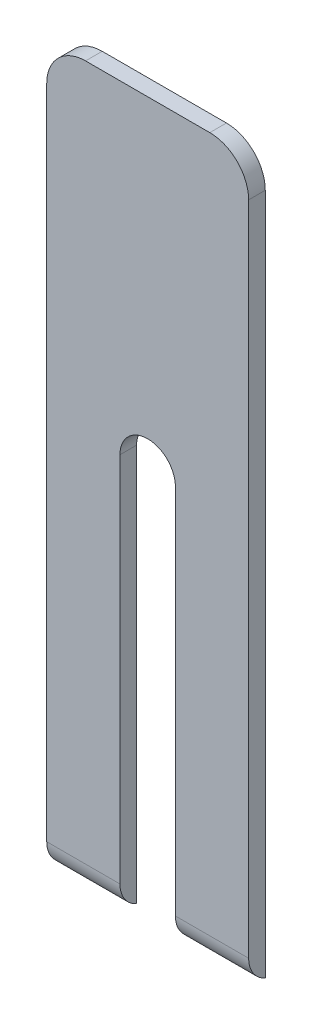
ISO-10303-21;
HEADER;
FILE_DESCRIPTION(('STEP AP214'),'2;1');
FILE_NAME('part.step','',(''),(''),'','','');
FILE_SCHEMA(('AUTOMOTIVE_DESIGN { 1 0 10303 214 1 1 1 1 }'));
ENDSEC;
DATA;
#1=APPLICATION_CONTEXT('core data for automotive mechanical design processes');
#2=APPLICATION_PROTOCOL_DEFINITION('international standard','automotive_design',2000,#1);
#3=PRODUCT_CONTEXT('',#1,'mechanical');
#4=PRODUCT('Part','Part','',(#3));
#5=PRODUCT_RELATED_PRODUCT_CATEGORY('part','',(#4));
#6=PRODUCT_DEFINITION_FORMATION('','',#4);
#7=PRODUCT_DEFINITION_CONTEXT('part definition',#1,'design');
#8=PRODUCT_DEFINITION('design','',#6,#7);
#9=PRODUCT_DEFINITION_SHAPE('','',#8);
#10=(LENGTH_UNIT() NAMED_UNIT(*) SI_UNIT(.MILLI.,.METRE.));
#11=(NAMED_UNIT(*) PLANE_ANGLE_UNIT() SI_UNIT($,.RADIAN.));
#12=(NAMED_UNIT(*) SI_UNIT($,.STERADIAN.) SOLID_ANGLE_UNIT());
#13=UNCERTAINTY_MEASURE_WITH_UNIT(LENGTH_MEASURE(1.E-05),#10,'distance_accuracy_value','');
#14=(GEOMETRIC_REPRESENTATION_CONTEXT(3) GLOBAL_UNCERTAINTY_ASSIGNED_CONTEXT((#13)) GLOBAL_UNIT_ASSIGNED_CONTEXT((#10,
#11,#12)) REPRESENTATION_CONTEXT('',''));
#15=CARTESIAN_POINT('',(0.,0.,0.));
#16=DIRECTION('',(0.,0.,1.));
#17=DIRECTION('',(1.,0.,0.));
#18=AXIS2_PLACEMENT_3D('',#15,#16,#17);
#19=CARTESIAN_POINT('',(1.32,0.,0.3));
#20=DIRECTION('',(-1.,0.,0.));
#21=DIRECTION('',(0.,-1.,0.));
#22=AXIS2_PLACEMENT_3D('',#19,#20,#21);
#23=PLANE('',#22);
#24=DIRECTION('',(0.,1.,0.));
#25=VECTOR('',#24,1.);
#26=CARTESIAN_POINT('',(1.32,0.,0.3));
#27=LINE('',#26,#25);
#28=CARTESIAN_POINT('',(1.32,0.458257569495584,0.3));
#29=VERTEX_POINT('',#28);
#30=CARTESIAN_POINT('',(1.32,7.16,0.3));
#31=VERTEX_POINT('',#30);
#32=EDGE_CURVE('E113',#29,#31,#27,.T.);
#33=ORIENTED_EDGE('',*,*,#32,.F.);
#34=CARTESIAN_POINT('',(1.32,0.458257569495584,-0.2));
#35=DIRECTION('',(-1.,0.,0.));
#36=DIRECTION('',(0.,-1.,0.));
#37=AXIS2_PLACEMENT_3D('',#34,#35,#36);
#38=CIRCLE('',#37,0.5);
#39=CARTESIAN_POINT('',(1.32,0.,0.));
#40=VERTEX_POINT('',#39);
#41=EDGE_CURVE('E185',#29,#40,#38,.F.);
#42=ORIENTED_EDGE('',*,*,#41,.T.);
#43=DIRECTION('',(0.,1.,0.));
#44=VECTOR('',#43,1.);
#45=CARTESIAN_POINT('',(1.32,0.,0.));
#46=LINE('',#45,#44);
#47=CARTESIAN_POINT('',(1.32,7.16,0.));
#48=VERTEX_POINT('',#47);
#49=EDGE_CURVE('E128',#40,#48,#46,.T.);
#50=ORIENTED_EDGE('',*,*,#49,.T.);
#51=DIRECTION('',(0.,0.,-1.));
#52=VECTOR('',#51,1.);
#53=CARTESIAN_POINT('',(1.32,7.16,0.3));
#54=LINE('',#53,#52);
#55=EDGE_CURVE('E126',#31,#48,#54,.T.);
#56=ORIENTED_EDGE('',*,*,#55,.F.);
#57=EDGE_LOOP('',(#33,#42,#50,#56));
#58=FACE_BOUND('',#57,.T.);
#59=ADVANCED_FACE('F36',(#58),#23,.F.);
#60=CARTESIAN_POINT('',(1.82,7.16,0.3));
#61=DIRECTION('',(0.,0.,-1.));
#62=DIRECTION('',(-1.,0.,0.));
#63=AXIS2_PLACEMENT_3D('',#60,#61,#62);
#64=CYLINDRICAL_SURFACE('',#63,0.499999999999999);
#65=CARTESIAN_POINT('',(1.82,7.16,0.));
#66=DIRECTION('',(0.,0.,-1.));
#67=DIRECTION('',(-1.,0.,0.));
#68=AXIS2_PLACEMENT_3D('',#65,#66,#67);
#69=CIRCLE('',#68,0.499999999999999);
#70=CARTESIAN_POINT('',(2.32,7.16,0.));
#71=VERTEX_POINT('',#70);
#72=EDGE_CURVE('E156',#48,#71,#69,.T.);
#73=ORIENTED_EDGE('',*,*,#72,.T.);
#74=DIRECTION('',(0.,0.,-1.));
#75=VECTOR('',#74,1.);
#76=CARTESIAN_POINT('',(2.32,7.16,0.3));
#77=LINE('',#76,#75);
#78=CARTESIAN_POINT('',(2.32,7.16,0.3));
#79=VERTEX_POINT('',#78);
#80=EDGE_CURVE('E132',#79,#71,#77,.T.);
#81=ORIENTED_EDGE('',*,*,#80,.F.);
#82=CARTESIAN_POINT('',(1.82,7.16,0.3));
#83=DIRECTION('',(0.,0.,-1.));
#84=DIRECTION('',(-1.,0.,0.));
#85=AXIS2_PLACEMENT_3D('',#82,#83,#84);
#86=CIRCLE('',#85,0.499999999999999);
#87=EDGE_CURVE('E118',#31,#79,#86,.T.);
#88=ORIENTED_EDGE('',*,*,#87,.F.);
#89=ORIENTED_EDGE('',*,*,#55,.T.);
#90=EDGE_LOOP('',(#73,#81,#88,#89));
#91=FACE_BOUND('',#90,.T.);
#92=ADVANCED_FACE('F134',(#91),#64,.F.);
#93=CARTESIAN_POINT('',(2.32,0.,0.3));
#94=DIRECTION('',(1.,0.,0.));
#95=DIRECTION('',(0.,1.,0.));
#96=AXIS2_PLACEMENT_3D('',#93,#94,#95);
#97=PLANE('',#96);
#98=DIRECTION('',(0.,-1.,0.));
#99=VECTOR('',#98,1.);
#100=CARTESIAN_POINT('',(2.32,0.,0.));
#101=LINE('',#100,#99);
#102=CARTESIAN_POINT('',(2.32,0.,0.));
#103=VERTEX_POINT('',#102);
#104=EDGE_CURVE('E158',#71,#103,#101,.T.);
#105=ORIENTED_EDGE('',*,*,#104,.T.);
#106=CARTESIAN_POINT('',(2.32,0.458257569495584,-0.2));
#107=DIRECTION('',(1.,0.,0.));
#108=DIRECTION('',(0.,1.,0.));
#109=AXIS2_PLACEMENT_3D('',#106,#107,#108);
#110=CIRCLE('',#109,0.5);
#111=CARTESIAN_POINT('',(2.32,0.458257569495584,0.3));
#112=VERTEX_POINT('',#111);
#113=EDGE_CURVE('E11',#103,#112,#110,.F.);
#114=ORIENTED_EDGE('',*,*,#113,.T.);
#115=DIRECTION('',(0.,-1.,0.));
#116=VECTOR('',#115,1.);
#117=CARTESIAN_POINT('',(2.32,0.,0.3));
#118=LINE('',#117,#116);
#119=EDGE_CURVE('E137',#79,#112,#118,.T.);
#120=ORIENTED_EDGE('',*,*,#119,.F.);
#121=ORIENTED_EDGE('',*,*,#80,.T.);
#122=EDGE_LOOP('',(#105,#114,#120,#121));
#123=FACE_BOUND('',#122,.T.);
#124=ADVANCED_FACE('F201',(#123),#97,.F.);
#125=CARTESIAN_POINT('',(3.64,0.,0.3));
#126=DIRECTION('',(-1.,0.,0.));
#127=DIRECTION('',(0.,0.,1.));
#128=AXIS2_PLACEMENT_3D('',#125,#126,#127);
#129=PLANE('',#128);
#130=DIRECTION('',(0.,1.,0.));
#131=VECTOR('',#130,1.);
#132=CARTESIAN_POINT('',(3.64,0.,0.3));
#133=LINE('',#132,#131);
#134=CARTESIAN_POINT('',(3.64,0.458257569495584,0.3));
#135=VERTEX_POINT('',#134);
#136=CARTESIAN_POINT('',(3.64,12.3,0.3));
#137=VERTEX_POINT('',#136);
#138=EDGE_CURVE('E139',#135,#137,#133,.T.);
#139=ORIENTED_EDGE('',*,*,#138,.F.);
#140=CARTESIAN_POINT('',(3.64,0.458257569495584,-0.2));
#141=DIRECTION('',(-1.,0.,0.));
#142=DIRECTION('',(0.,0.,1.));
#143=AXIS2_PLACEMENT_3D('',#140,#141,#142);
#144=CIRCLE('',#143,0.5);
#145=CARTESIAN_POINT('',(3.64,0.,0.));
#146=VERTEX_POINT('',#145);
#147=EDGE_CURVE('E44',#135,#146,#144,.F.);
#148=ORIENTED_EDGE('',*,*,#147,.T.);
#149=DIRECTION('',(0.,1.,0.));
#150=VECTOR('',#149,1.);
#151=CARTESIAN_POINT('',(3.64,0.,0.));
#152=LINE('',#151,#150);
#153=CARTESIAN_POINT('',(3.64,12.3,0.));
#154=VERTEX_POINT('',#153);
#155=EDGE_CURVE('E162',#146,#154,#152,.T.);
#156=ORIENTED_EDGE('',*,*,#155,.T.);
#157=DIRECTION('',(0.,0.,-1.));
#158=VECTOR('',#157,1.);
#159=CARTESIAN_POINT('',(3.64,12.3,0.3));
#160=LINE('',#159,#158);
#161=EDGE_CURVE('E179',#137,#154,#160,.T.);
#162=ORIENTED_EDGE('',*,*,#161,.F.);
#163=EDGE_LOOP('',(#139,#148,#156,#162));
#164=FACE_BOUND('',#163,.T.);
#165=ADVANCED_FACE('F190',(#164),#129,.F.);
#166=CARTESIAN_POINT('',(2.94,12.3,0.3));
#167=DIRECTION('',(0.,0.,-1.));
#168=DIRECTION('',(-1.,0.,0.));
#169=AXIS2_PLACEMENT_3D('',#166,#167,#168);
#170=CYLINDRICAL_SURFACE('',#169,0.7);
#171=CARTESIAN_POINT('',(2.94,12.3,0.));
#172=DIRECTION('',(0.,0.,1.));
#173=DIRECTION('',(-1.,0.,0.));
#174=AXIS2_PLACEMENT_3D('',#171,#172,#173);
#175=CIRCLE('',#174,0.7);
#176=CARTESIAN_POINT('',(2.94,13.,0.));
#177=VERTEX_POINT('',#176);
#178=EDGE_CURVE('E164',#154,#177,#175,.T.);
#179=ORIENTED_EDGE('',*,*,#178,.T.);
#180=DIRECTION('',(0.,0.,-1.));
#181=VECTOR('',#180,1.);
#182=CARTESIAN_POINT('',(2.94,13.,0.3));
#183=LINE('',#182,#181);
#184=CARTESIAN_POINT('',(2.94,13.,0.3));
#185=VERTEX_POINT('',#184);
#186=EDGE_CURVE('E176',#185,#177,#183,.T.);
#187=ORIENTED_EDGE('',*,*,#186,.F.);
#188=CARTESIAN_POINT('',(2.94,12.3,0.3));
#189=DIRECTION('',(0.,0.,1.));
#190=DIRECTION('',(-1.,0.,0.));
#191=AXIS2_PLACEMENT_3D('',#188,#189,#190);
#192=CIRCLE('',#191,0.7);
#193=EDGE_CURVE('E143',#137,#185,#192,.T.);
#194=ORIENTED_EDGE('',*,*,#193,.F.);
#195=ORIENTED_EDGE('',*,*,#161,.T.);
#196=EDGE_LOOP('',(#179,#187,#194,#195));
#197=FACE_BOUND('',#196,.T.);
#198=ADVANCED_FACE('F205',(#197),#170,.T.);
#199=CARTESIAN_POINT('',(0.700000000000005,13.,0.3));
#200=DIRECTION('',(0.,-1.,0.));
#201=DIRECTION('',(0.,0.,-1.));
#202=AXIS2_PLACEMENT_3D('',#199,#200,#201);
#203=PLANE('',#202);
#204=DIRECTION('',(-1.,0.,0.));
#205=VECTOR('',#204,1.);
#206=CARTESIAN_POINT('',(0.700000000000005,13.,0.));
#207=LINE('',#206,#205);
#208=CARTESIAN_POINT('',(0.700000000000005,13.,0.));
#209=VERTEX_POINT('',#208);
#210=EDGE_CURVE('E166',#177,#209,#207,.T.);
#211=ORIENTED_EDGE('',*,*,#210,.T.);
#212=DIRECTION('',(0.,0.,-1.));
#213=VECTOR('',#212,1.);
#214=CARTESIAN_POINT('',(0.700000000000005,13.,0.3));
#215=LINE('',#214,#213);
#216=CARTESIAN_POINT('',(0.700000000000005,13.,0.3));
#217=VERTEX_POINT('',#216);
#218=EDGE_CURVE('E173',#217,#209,#215,.T.);
#219=ORIENTED_EDGE('',*,*,#218,.F.);
#220=DIRECTION('',(-1.,0.,0.));
#221=VECTOR('',#220,1.);
#222=CARTESIAN_POINT('',(0.700000000000005,13.,0.3));
#223=LINE('',#222,#221);
#224=EDGE_CURVE('E145',#185,#217,#223,.T.);
#225=ORIENTED_EDGE('',*,*,#224,.F.);
#226=ORIENTED_EDGE('',*,*,#186,.T.);
#227=EDGE_LOOP('',(#211,#219,#225,#226));
#228=FACE_BOUND('',#227,.T.);
#229=ADVANCED_FACE('F209',(#228),#203,.F.);
#230=CARTESIAN_POINT('',(0.7,12.3,0.3));
#231=DIRECTION('',(0.,0.,-1.));
#232=DIRECTION('',(-1.,0.,0.));
#233=AXIS2_PLACEMENT_3D('',#230,#231,#232);
#234=CYLINDRICAL_SURFACE('',#233,0.7);
#235=CARTESIAN_POINT('',(0.7,12.3,0.));
#236=DIRECTION('',(0.,0.,1.));
#237=DIRECTION('',(-1.,0.,0.));
#238=AXIS2_PLACEMENT_3D('',#235,#236,#237);
#239=CIRCLE('',#238,0.7);
#240=CARTESIAN_POINT('',(0.,12.3,0.));
#241=VERTEX_POINT('',#240);
#242=EDGE_CURVE('E168',#209,#241,#239,.T.);
#243=ORIENTED_EDGE('',*,*,#242,.T.);
#244=DIRECTION('',(0.,0.,-1.));
#245=VECTOR('',#244,1.);
#246=CARTESIAN_POINT('',(0.,12.3,0.3));
#247=LINE('',#246,#245);
#248=CARTESIAN_POINT('',(0.,12.3,0.3));
#249=VERTEX_POINT('',#248);
#250=EDGE_CURVE('E151',#249,#241,#247,.T.);
#251=ORIENTED_EDGE('',*,*,#250,.F.);
#252=CARTESIAN_POINT('',(0.7,12.3,0.3));
#253=DIRECTION('',(0.,0.,1.));
#254=DIRECTION('',(-1.,0.,0.));
#255=AXIS2_PLACEMENT_3D('',#252,#253,#254);
#256=CIRCLE('',#255,0.7);
#257=EDGE_CURVE('E147',#217,#249,#256,.T.);
#258=ORIENTED_EDGE('',*,*,#257,.F.);
#259=ORIENTED_EDGE('',*,*,#218,.T.);
#260=EDGE_LOOP('',(#243,#251,#258,#259));
#261=FACE_BOUND('',#260,.T.);
#262=ADVANCED_FACE('F213',(#261),#234,.T.);
#263=CARTESIAN_POINT('',(0.,0.,0.3));
#264=DIRECTION('',(1.,0.,0.));
#265=DIRECTION('',(0.,0.,-1.));
#266=AXIS2_PLACEMENT_3D('',#263,#264,#265);
#267=PLANE('',#266);
#268=DIRECTION('',(0.,-1.,0.));
#269=VECTOR('',#268,1.);
#270=CARTESIAN_POINT('',(0.,0.,0.));
#271=LINE('',#270,#269);
#272=CARTESIAN_POINT('',(0.,0.,0.));
#273=VERTEX_POINT('',#272);
#274=EDGE_CURVE('E123',#241,#273,#271,.T.);
#275=ORIENTED_EDGE('',*,*,#274,.T.);
#276=CARTESIAN_POINT('',(0.,0.458257569495584,-0.2));
#277=DIRECTION('',(1.,0.,0.));
#278=DIRECTION('',(0.,0.,-1.));
#279=AXIS2_PLACEMENT_3D('',#276,#277,#278);
#280=CIRCLE('',#279,0.5);
#281=CARTESIAN_POINT('',(0.,0.458257569495584,0.3));
#282=VERTEX_POINT('',#281);
#283=EDGE_CURVE('E51',#273,#282,#280,.F.);
#284=ORIENTED_EDGE('',*,*,#283,.T.);
#285=DIRECTION('',(0.,-1.,0.));
#286=VECTOR('',#285,1.);
#287=CARTESIAN_POINT('',(0.,0.,0.3));
#288=LINE('',#287,#286);
#289=EDGE_CURVE('E149',#249,#282,#288,.T.);
#290=ORIENTED_EDGE('',*,*,#289,.F.);
#291=ORIENTED_EDGE('',*,*,#250,.T.);
#292=EDGE_LOOP('',(#275,#284,#290,#291));
#293=FACE_BOUND('',#292,.T.);
#294=ADVANCED_FACE('F216',(#293),#267,.F.);
#295=CARTESIAN_POINT('',(1.82,7.16,0.3));
#296=DIRECTION('',(0.,0.,-1.));
#297=DIRECTION('',(-1.,0.,0.));
#298=AXIS2_PLACEMENT_3D('',#295,#296,#297);
#299=PLANE('',#298);
#300=ORIENTED_EDGE('',*,*,#289,.T.);
#301=DIRECTION('',(-1.,0.,0.));
#302=VECTOR('',#301,1.);
#303=CARTESIAN_POINT('',(1.82,0.458257569495584,0.3));
#304=LINE('',#303,#302);
#305=EDGE_CURVE('E121',#282,#29,#304,.F.);
#306=ORIENTED_EDGE('',*,*,#305,.T.);
#307=ORIENTED_EDGE('',*,*,#32,.T.);
#308=ORIENTED_EDGE('',*,*,#87,.T.);
#309=ORIENTED_EDGE('',*,*,#119,.T.);
#310=DIRECTION('',(-1.,0.,0.));
#311=VECTOR('',#310,1.);
#312=CARTESIAN_POINT('',(1.82,0.458257569495584,0.3));
#313=LINE('',#312,#311);
#314=EDGE_CURVE('E131',#112,#135,#313,.F.);
#315=ORIENTED_EDGE('',*,*,#314,.T.);
#316=ORIENTED_EDGE('',*,*,#138,.T.);
#317=ORIENTED_EDGE('',*,*,#193,.T.);
#318=ORIENTED_EDGE('',*,*,#224,.T.);
#319=ORIENTED_EDGE('',*,*,#257,.T.);
#320=EDGE_LOOP('',(#300,#306,#307,#308,#309,#315,#316,#317,#318,#319));
#321=FACE_BOUND('',#320,.T.);
#322=ADVANCED_FACE('F115',(#321),#299,.F.);
#323=CARTESIAN_POINT('',(1.82,7.16,0.));
#324=DIRECTION('',(0.,0.,-1.));
#325=DIRECTION('',(-1.,0.,0.));
#326=AXIS2_PLACEMENT_3D('',#323,#324,#325);
#327=PLANE('',#326);
#328=DIRECTION('',(1.,0.,0.));
#329=VECTOR('',#328,1.);
#330=CARTESIAN_POINT('',(0.,0.,0.));
#331=LINE('',#330,#329);
#332=EDGE_CURVE('E152',#273,#40,#331,.T.);
#333=ORIENTED_EDGE('',*,*,#332,.F.);
#334=ORIENTED_EDGE('',*,*,#274,.F.);
#335=ORIENTED_EDGE('',*,*,#242,.F.);
#336=ORIENTED_EDGE('',*,*,#210,.F.);
#337=ORIENTED_EDGE('',*,*,#178,.F.);
#338=ORIENTED_EDGE('',*,*,#155,.F.);
#339=DIRECTION('',(1.,0.,0.));
#340=VECTOR('',#339,1.);
#341=CARTESIAN_POINT('',(3.64,0.,0.));
#342=LINE('',#341,#340);
#343=EDGE_CURVE('E160',#103,#146,#342,.T.);
#344=ORIENTED_EDGE('',*,*,#343,.F.);
#345=ORIENTED_EDGE('',*,*,#104,.F.);
#346=ORIENTED_EDGE('',*,*,#72,.F.);
#347=ORIENTED_EDGE('',*,*,#49,.F.);
#348=EDGE_LOOP('',(#333,#334,#335,#336,#337,#338,#344,#345,#346,#347));
#349=FACE_BOUND('',#348,.T.);
#350=ADVANCED_FACE('F196',(#349),#327,.T.);
#351=CARTESIAN_POINT('',(0.,0.458257569495584,-0.2));
#352=DIRECTION('',(-1.,0.,0.));
#353=DIRECTION('',(0.,0.,1.));
#354=AXIS2_PLACEMENT_3D('',#351,#352,#353);
#355=CYLINDRICAL_SURFACE('',#354,0.5);
#356=ORIENTED_EDGE('',*,*,#283,.F.);
#357=ORIENTED_EDGE('',*,*,#332,.T.);
#358=ORIENTED_EDGE('',*,*,#41,.F.);
#359=ORIENTED_EDGE('',*,*,#305,.F.);
#360=EDGE_LOOP('',(#356,#357,#358,#359));
#361=FACE_BOUND('',#360,.T.);
#362=ADVANCED_FACE('F233',(#361),#355,.T.);
#363=CARTESIAN_POINT('',(3.64,0.458257569495584,-0.2));
#364=DIRECTION('',(-1.,0.,0.));
#365=DIRECTION('',(0.,-1.,0.));
#366=AXIS2_PLACEMENT_3D('',#363,#364,#365);
#367=CYLINDRICAL_SURFACE('',#366,0.5);
#368=ORIENTED_EDGE('',*,*,#113,.F.);
#369=ORIENTED_EDGE('',*,*,#343,.T.);
#370=ORIENTED_EDGE('',*,*,#147,.F.);
#371=ORIENTED_EDGE('',*,*,#314,.F.);
#372=EDGE_LOOP('',(#368,#369,#370,#371));
#373=FACE_BOUND('',#372,.T.);
#374=ADVANCED_FACE('F38',(#373),#367,.T.);
#375=CLOSED_SHELL('',(#59,#92,#124,#165,#198,#229,#262,#294,#322,#350,#362,#374));
#376=MANIFOLD_SOLID_BREP('B2',#375);
#377=ADVANCED_BREP_SHAPE_REPRESENTATION('',(#18,#376),#14);
#378=SHAPE_DEFINITION_REPRESENTATION(#9,#377);
ENDSEC;
END-ISO-10303-21;
